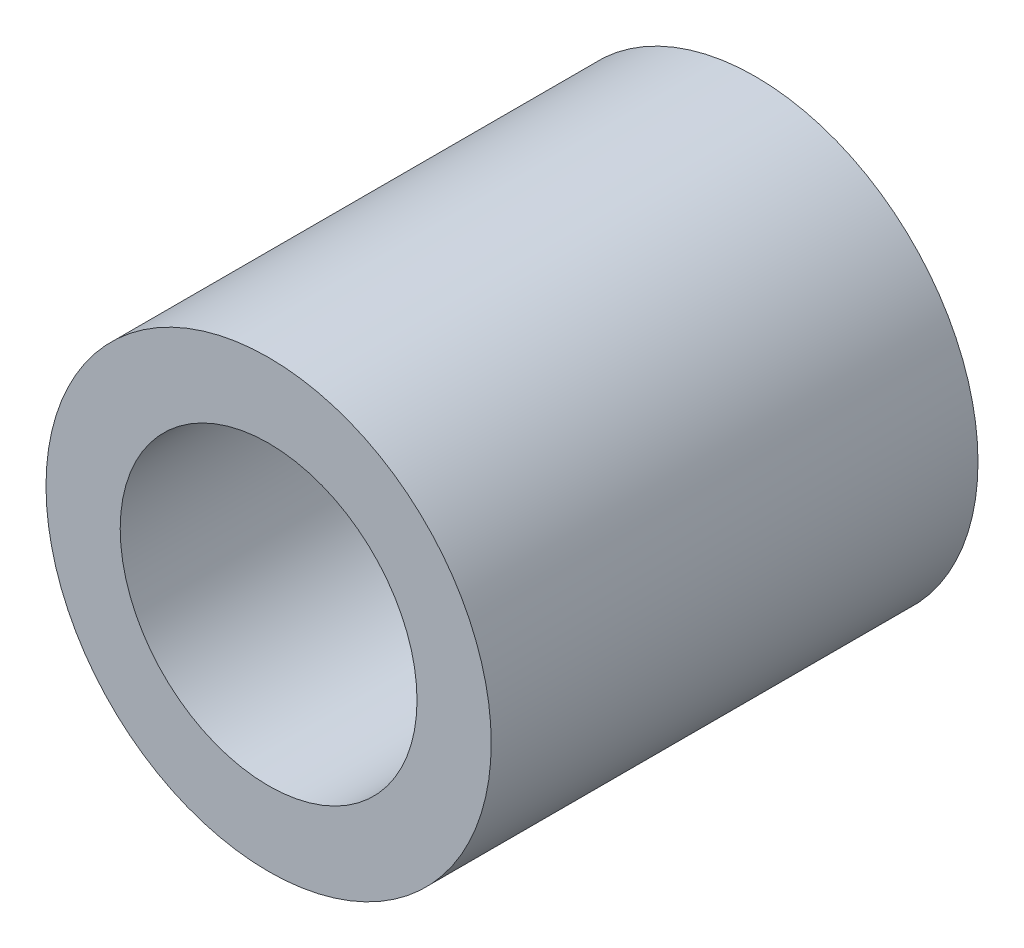
ISO-10303-21;
HEADER;
FILE_DESCRIPTION(('STEP AP214'),'2;1');
FILE_NAME('part.step','',(''),(''),'','','');
FILE_SCHEMA(('AUTOMOTIVE_DESIGN { 1 0 10303 214 1 1 1 1 }'));
ENDSEC;
DATA;
#1=APPLICATION_CONTEXT('core data for automotive mechanical design processes');
#2=APPLICATION_PROTOCOL_DEFINITION('international standard','automotive_design',2000,#1);
#3=PRODUCT_CONTEXT('',#1,'mechanical');
#4=PRODUCT('Part','Part','',(#3));
#5=PRODUCT_RELATED_PRODUCT_CATEGORY('part','',(#4));
#6=PRODUCT_DEFINITION_FORMATION('','',#4);
#7=PRODUCT_DEFINITION_CONTEXT('part definition',#1,'design');
#8=PRODUCT_DEFINITION('design','',#6,#7);
#9=PRODUCT_DEFINITION_SHAPE('','',#8);
#10=(LENGTH_UNIT() NAMED_UNIT(*) SI_UNIT(.MILLI.,.METRE.));
#11=(NAMED_UNIT(*) PLANE_ANGLE_UNIT() SI_UNIT($,.RADIAN.));
#12=(NAMED_UNIT(*) SI_UNIT($,.STERADIAN.) SOLID_ANGLE_UNIT());
#13=UNCERTAINTY_MEASURE_WITH_UNIT(LENGTH_MEASURE(1.E-05),#10,'distance_accuracy_value','');
#14=(GEOMETRIC_REPRESENTATION_CONTEXT(3) GLOBAL_UNCERTAINTY_ASSIGNED_CONTEXT((#13)) GLOBAL_UNIT_ASSIGNED_CONTEXT((#10,
#11,#12)) REPRESENTATION_CONTEXT('',''));
#15=CARTESIAN_POINT('',(0.,0.,0.));
#16=DIRECTION('',(0.,0.,1.));
#17=DIRECTION('',(1.,0.,0.));
#18=AXIS2_PLACEMENT_3D('',#15,#16,#17);
#19=CARTESIAN_POINT('',(0.,0.,820.));
#20=DIRECTION('',(0.,0.,1.));
#21=DIRECTION('',(1.,0.,0.));
#22=AXIS2_PLACEMENT_3D('',#19,#20,#21);
#23=PLANE('',#22);
#24=CARTESIAN_POINT('',(0.,0.,820.));
#25=DIRECTION('',(0.,0.,1.));
#26=DIRECTION('',(1.,0.,0.));
#27=AXIS2_PLACEMENT_3D('',#24,#25,#26);
#28=CIRCLE('',#27,375.);
#29=CARTESIAN_POINT('',(-375.,0.,820.));
#30=VERTEX_POINT('',#29);
#31=EDGE_CURVE('E10',#30,#30,#28,.T.);
#32=ORIENTED_EDGE('',*,*,#31,.T.);
#33=EDGE_LOOP('',(#32));
#34=FACE_BOUND('',#33,.T.);
#35=CARTESIAN_POINT('',(0.,0.,820.));
#36=DIRECTION('',(0.,0.,1.));
#37=DIRECTION('',(1.,0.,0.));
#38=AXIS2_PLACEMENT_3D('',#35,#36,#37);
#39=CIRCLE('',#38,250.);
#40=CARTESIAN_POINT('',(-250.,0.,820.));
#41=VERTEX_POINT('',#40);
#42=EDGE_CURVE('E54',#41,#41,#39,.T.);
#43=ORIENTED_EDGE('',*,*,#42,.F.);
#44=EDGE_LOOP('',(#43));
#45=FACE_BOUND('',#44,.T.);
#46=ADVANCED_FACE('F43',(#34,#45),#23,.T.);
#47=CARTESIAN_POINT('',(0.,0.,0.));
#48=DIRECTION('',(0.,0.,1.));
#49=DIRECTION('',(1.,0.,0.));
#50=AXIS2_PLACEMENT_3D('',#47,#48,#49);
#51=PLANE('',#50);
#52=CARTESIAN_POINT('',(0.,0.,0.));
#53=DIRECTION('',(0.,0.,1.));
#54=DIRECTION('',(1.,0.,0.));
#55=AXIS2_PLACEMENT_3D('',#52,#53,#54);
#56=CIRCLE('',#55,375.);
#57=CARTESIAN_POINT('',(-375.,0.,0.));
#58=VERTEX_POINT('',#57);
#59=EDGE_CURVE('E47',#58,#58,#56,.T.);
#60=ORIENTED_EDGE('',*,*,#59,.F.);
#61=EDGE_LOOP('',(#60));
#62=FACE_BOUND('',#61,.T.);
#63=CARTESIAN_POINT('',(0.,0.,0.));
#64=DIRECTION('',(0.,0.,1.));
#65=DIRECTION('',(1.,0.,0.));
#66=AXIS2_PLACEMENT_3D('',#63,#64,#65);
#67=CIRCLE('',#66,250.);
#68=CARTESIAN_POINT('',(-250.,0.,0.));
#69=VERTEX_POINT('',#68);
#70=EDGE_CURVE('E56',#69,#69,#67,.T.);
#71=ORIENTED_EDGE('',*,*,#70,.T.);
#72=EDGE_LOOP('',(#71));
#73=FACE_BOUND('',#72,.T.);
#74=ADVANCED_FACE('F66',(#62,#73),#51,.F.);
#75=CARTESIAN_POINT('',(0.,0.,820.));
#76=DIRECTION('',(0.,0.,-1.));
#77=DIRECTION('',(-1.,0.,0.));
#78=AXIS2_PLACEMENT_3D('',#75,#76,#77);
#79=CYLINDRICAL_SURFACE('',#78,375.);
#80=CARTESIAN_POINT('',(-375.,0.,820.));
#81=CARTESIAN_POINT('',(-375.,0.,811.458333333333));
#82=CARTESIAN_POINT('',(-375.,0.,802.916666666667));
#83=CARTESIAN_POINT('',(-375.,0.,785.833333333333));
#84=CARTESIAN_POINT('',(-375.,0.,777.291666666667));
#85=CARTESIAN_POINT('',(-375.,0.,760.208333333333));
#86=CARTESIAN_POINT('',(-375.,0.,751.666666666667));
#87=CARTESIAN_POINT('',(-375.,0.,734.583333333333));
#88=CARTESIAN_POINT('',(-375.,0.,726.041666666667));
#89=CARTESIAN_POINT('',(-375.,0.,708.958333333333));
#90=CARTESIAN_POINT('',(-375.,0.,700.416666666667));
#91=CARTESIAN_POINT('',(-375.,0.,683.333333333333));
#92=CARTESIAN_POINT('',(-375.,0.,674.791666666667));
#93=CARTESIAN_POINT('',(-375.,0.,657.708333333333));
#94=CARTESIAN_POINT('',(-375.,0.,649.166666666667));
#95=CARTESIAN_POINT('',(-375.,0.,632.083333333333));
#96=CARTESIAN_POINT('',(-375.,0.,623.541666666667));
#97=CARTESIAN_POINT('',(-375.,0.,606.458333333333));
#98=CARTESIAN_POINT('',(-375.,0.,597.916666666667));
#99=CARTESIAN_POINT('',(-375.,0.,580.833333333333));
#100=CARTESIAN_POINT('',(-375.,0.,572.291666666667));
#101=CARTESIAN_POINT('',(-375.,0.,555.208333333333));
#102=CARTESIAN_POINT('',(-375.,0.,546.666666666667));
#103=CARTESIAN_POINT('',(-375.,0.,529.583333333333));
#104=CARTESIAN_POINT('',(-375.,0.,521.041666666667));
#105=CARTESIAN_POINT('',(-375.,0.,503.958333333333));
#106=CARTESIAN_POINT('',(-375.,0.,495.416666666667));
#107=CARTESIAN_POINT('',(-375.,0.,478.333333333333));
#108=CARTESIAN_POINT('',(-375.,0.,469.791666666667));
#109=CARTESIAN_POINT('',(-375.,0.,452.708333333333));
#110=CARTESIAN_POINT('',(-375.,0.,444.166666666667));
#111=CARTESIAN_POINT('',(-375.,0.,427.083333333333));
#112=CARTESIAN_POINT('',(-375.,0.,418.541666666667));
#113=CARTESIAN_POINT('',(-375.,0.,401.458333333333));
#114=CARTESIAN_POINT('',(-375.,0.,392.916666666667));
#115=CARTESIAN_POINT('',(-375.,0.,375.833333333333));
#116=CARTESIAN_POINT('',(-375.,0.,367.291666666667));
#117=CARTESIAN_POINT('',(-375.,0.,350.208333333333));
#118=CARTESIAN_POINT('',(-375.,0.,341.666666666667));
#119=CARTESIAN_POINT('',(-375.,0.,324.583333333333));
#120=CARTESIAN_POINT('',(-375.,0.,316.041666666667));
#121=CARTESIAN_POINT('',(-375.,0.,298.958333333333));
#122=CARTESIAN_POINT('',(-375.,0.,290.416666666667));
#123=CARTESIAN_POINT('',(-375.,0.,273.333333333333));
#124=CARTESIAN_POINT('',(-375.,0.,264.791666666667));
#125=CARTESIAN_POINT('',(-375.,0.,247.708333333333));
#126=CARTESIAN_POINT('',(-375.,0.,239.166666666667));
#127=CARTESIAN_POINT('',(-375.,0.,222.083333333333));
#128=CARTESIAN_POINT('',(-375.,0.,213.541666666667));
#129=CARTESIAN_POINT('',(-375.,0.,196.458333333333));
#130=CARTESIAN_POINT('',(-375.,0.,187.916666666667));
#131=CARTESIAN_POINT('',(-375.,0.,170.833333333333));
#132=CARTESIAN_POINT('',(-375.,0.,162.291666666667));
#133=CARTESIAN_POINT('',(-375.,0.,145.208333333333));
#134=CARTESIAN_POINT('',(-375.,0.,136.666666666667));
#135=CARTESIAN_POINT('',(-375.,0.,119.583333333333));
#136=CARTESIAN_POINT('',(-375.,0.,111.041666666667));
#137=CARTESIAN_POINT('',(-375.,0.,93.9583333333334));
#138=CARTESIAN_POINT('',(-375.,0.,85.4166666666667));
#139=CARTESIAN_POINT('',(-375.,0.,68.3333333333334));
#140=CARTESIAN_POINT('',(-375.,0.,59.7916666666667));
#141=CARTESIAN_POINT('',(-375.,0.,42.7083333333333));
#142=CARTESIAN_POINT('',(-375.,0.,34.1666666666667));
#143=CARTESIAN_POINT('',(-375.,0.,17.0833333333333));
#144=CARTESIAN_POINT('',(-375.,0.,8.54166666666666));
#145=CARTESIAN_POINT('',(-375.,0.,0.));
#146=B_SPLINE_CURVE_WITH_KNOTS('',3,(#80,#81,#82,#83,#84,#85,#86,#87,#88,#89,#90,#91,#92,#93,
#94,#95,#96,#97,#98,#99,#100,#101,#102,#103,#104,#105,#106,#107,#108,#109,#110,#111,#112,#113,
#114,#115,#116,#117,#118,#119,#120,#121,#122,#123,#124,#125,#126,#127,#128,#129,#130,#131,#132,
#133,#134,#135,#136,#137,#138,#139,#140,#141,#142,#143,#144,#145),.UNSPECIFIED.,.F.,.F.,(4,2,2,
2,2,2,2,2,2,2,2,2,2,2,2,2,2,2,2,2,2,2,2,2,2,2,2,2,2,2,2,2,4),(0.,25.625,51.25,76.875,102.5,
128.125,153.75,179.375,205.,230.625,256.25,281.875,307.5,333.125,358.75,384.375,410.,435.625,
461.25,486.875,512.5,538.125,563.75,589.375,615.,640.625,666.25,691.875,717.5,743.125,768.75,
794.375,820.),.UNSPECIFIED.);
#147=EDGE_CURVE('BSEAM45',#30,#58,#146,.T.);
#148=ORIENTED_EDGE('',*,*,#31,.F.);
#149=ORIENTED_EDGE('',*,*,#59,.T.);
#150=ORIENTED_EDGE('',*,*,#147,.T.);
#151=ORIENTED_EDGE('',*,*,#147,.F.);
#152=EDGE_LOOP('',(#148,#150,#149,#151));
#153=FACE_BOUND('',#152,.T.);
#154=ADVANCED_FACE('F45',(#153),#79,.T.);
#155=CARTESIAN_POINT('',(0.,0.,820.));
#156=DIRECTION('',(0.,0.,-1.));
#157=DIRECTION('',(-1.,0.,0.));
#158=AXIS2_PLACEMENT_3D('',#155,#156,#157);
#159=CYLINDRICAL_SURFACE('',#158,250.);
#160=CARTESIAN_POINT('',(-250.,0.,820.));
#161=CARTESIAN_POINT('',(-250.,0.,811.458333333333));
#162=CARTESIAN_POINT('',(-250.,0.,802.916666666667));
#163=CARTESIAN_POINT('',(-250.,0.,785.833333333333));
#164=CARTESIAN_POINT('',(-250.,0.,777.291666666667));
#165=CARTESIAN_POINT('',(-250.,0.,760.208333333333));
#166=CARTESIAN_POINT('',(-250.,0.,751.666666666667));
#167=CARTESIAN_POINT('',(-250.,0.,734.583333333333));
#168=CARTESIAN_POINT('',(-250.,0.,726.041666666667));
#169=CARTESIAN_POINT('',(-250.,0.,708.958333333333));
#170=CARTESIAN_POINT('',(-250.,0.,700.416666666667));
#171=CARTESIAN_POINT('',(-250.,0.,683.333333333333));
#172=CARTESIAN_POINT('',(-250.,0.,674.791666666667));
#173=CARTESIAN_POINT('',(-250.,0.,657.708333333333));
#174=CARTESIAN_POINT('',(-250.,0.,649.166666666667));
#175=CARTESIAN_POINT('',(-250.,0.,632.083333333333));
#176=CARTESIAN_POINT('',(-250.,0.,623.541666666667));
#177=CARTESIAN_POINT('',(-250.,0.,606.458333333333));
#178=CARTESIAN_POINT('',(-250.,0.,597.916666666667));
#179=CARTESIAN_POINT('',(-250.,0.,580.833333333333));
#180=CARTESIAN_POINT('',(-250.,0.,572.291666666667));
#181=CARTESIAN_POINT('',(-250.,0.,555.208333333333));
#182=CARTESIAN_POINT('',(-250.,0.,546.666666666667));
#183=CARTESIAN_POINT('',(-250.,0.,529.583333333333));
#184=CARTESIAN_POINT('',(-250.,0.,521.041666666667));
#185=CARTESIAN_POINT('',(-250.,0.,503.958333333333));
#186=CARTESIAN_POINT('',(-250.,0.,495.416666666667));
#187=CARTESIAN_POINT('',(-250.,0.,478.333333333333));
#188=CARTESIAN_POINT('',(-250.,0.,469.791666666667));
#189=CARTESIAN_POINT('',(-250.,0.,452.708333333333));
#190=CARTESIAN_POINT('',(-250.,0.,444.166666666667));
#191=CARTESIAN_POINT('',(-250.,0.,427.083333333333));
#192=CARTESIAN_POINT('',(-250.,0.,418.541666666667));
#193=CARTESIAN_POINT('',(-250.,0.,401.458333333333));
#194=CARTESIAN_POINT('',(-250.,0.,392.916666666667));
#195=CARTESIAN_POINT('',(-250.,0.,375.833333333333));
#196=CARTESIAN_POINT('',(-250.,0.,367.291666666667));
#197=CARTESIAN_POINT('',(-250.,0.,350.208333333333));
#198=CARTESIAN_POINT('',(-250.,0.,341.666666666667));
#199=CARTESIAN_POINT('',(-250.,0.,324.583333333333));
#200=CARTESIAN_POINT('',(-250.,0.,316.041666666667));
#201=CARTESIAN_POINT('',(-250.,0.,298.958333333333));
#202=CARTESIAN_POINT('',(-250.,0.,290.416666666667));
#203=CARTESIAN_POINT('',(-250.,0.,273.333333333333));
#204=CARTESIAN_POINT('',(-250.,0.,264.791666666667));
#205=CARTESIAN_POINT('',(-250.,0.,247.708333333333));
#206=CARTESIAN_POINT('',(-250.,0.,239.166666666667));
#207=CARTESIAN_POINT('',(-250.,0.,222.083333333333));
#208=CARTESIAN_POINT('',(-250.,0.,213.541666666667));
#209=CARTESIAN_POINT('',(-250.,0.,196.458333333333));
#210=CARTESIAN_POINT('',(-250.,0.,187.916666666667));
#211=CARTESIAN_POINT('',(-250.,0.,170.833333333333));
#212=CARTESIAN_POINT('',(-250.,0.,162.291666666667));
#213=CARTESIAN_POINT('',(-250.,0.,145.208333333333));
#214=CARTESIAN_POINT('',(-250.,0.,136.666666666667));
#215=CARTESIAN_POINT('',(-250.,0.,119.583333333333));
#216=CARTESIAN_POINT('',(-250.,0.,111.041666666667));
#217=CARTESIAN_POINT('',(-250.,0.,93.9583333333334));
#218=CARTESIAN_POINT('',(-250.,0.,85.4166666666667));
#219=CARTESIAN_POINT('',(-250.,0.,68.3333333333334));
#220=CARTESIAN_POINT('',(-250.,0.,59.7916666666667));
#221=CARTESIAN_POINT('',(-250.,0.,42.7083333333333));
#222=CARTESIAN_POINT('',(-250.,0.,34.1666666666667));
#223=CARTESIAN_POINT('',(-250.,0.,17.0833333333333));
#224=CARTESIAN_POINT('',(-250.,0.,8.54166666666666));
#225=CARTESIAN_POINT('',(-250.,0.,0.));
#226=B_SPLINE_CURVE_WITH_KNOTS('',3,(#160,#161,#162,#163,#164,#165,#166,#167,#168,#169,#170,
#171,#172,#173,#174,#175,#176,#177,#178,#179,#180,#181,#182,#183,#184,#185,#186,#187,#188,#189,
#190,#191,#192,#193,#194,#195,#196,#197,#198,#199,#200,#201,#202,#203,#204,#205,#206,#207,#208,
#209,#210,#211,#212,#213,#214,#215,#216,#217,#218,#219,#220,#221,#222,#223,#224,#225),
.UNSPECIFIED.,.F.,.F.,(4,2,2,2,2,2,2,2,2,2,2,2,2,2,2,2,2,2,2,2,2,2,2,2,2,2,2,2,2,2,2,2,4),(0.,
25.6249999999999,51.2499999999999,76.8749999999999,102.5,128.125,153.75,179.375,205.,230.625,
256.25,281.875,307.5,333.125,358.75,384.375,410.,435.625,461.25,486.875,512.5,538.125,563.75,
589.375,615.,640.625,666.25,691.875,717.5,743.125,768.75,794.375,820.),.UNSPECIFIED.);
#227=EDGE_CURVE('BSEAM62',#41,#69,#226,.T.);
#228=ORIENTED_EDGE('',*,*,#42,.T.);
#229=ORIENTED_EDGE('',*,*,#70,.F.);
#230=ORIENTED_EDGE('',*,*,#227,.T.);
#231=ORIENTED_EDGE('',*,*,#227,.F.);
#232=EDGE_LOOP('',(#228,#230,#229,#231));
#233=FACE_BOUND('',#232,.T.);
#234=ADVANCED_FACE('F62',(#233),#159,.F.);
#235=CLOSED_SHELL('',(#46,#74,#154,#234));
#236=MANIFOLD_SOLID_BREP('B2',#235);
#237=ADVANCED_BREP_SHAPE_REPRESENTATION('',(#18,#236),#14);
#238=SHAPE_DEFINITION_REPRESENTATION(#9,#237);
ENDSEC;
END-ISO-10303-21;
